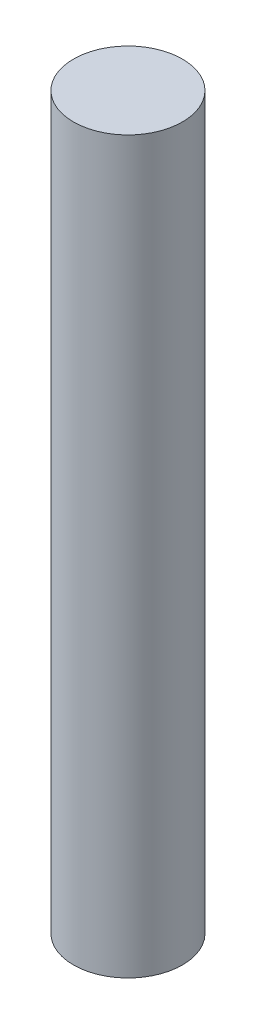
ISO-10303-21;
HEADER;
FILE_DESCRIPTION(('STEP AP214'),'2;1');
FILE_NAME('part.step','',(''),(''),'','','');
FILE_SCHEMA(('AUTOMOTIVE_DESIGN { 1 0 10303 214 1 1 1 1 }'));
ENDSEC;
DATA;
#1=APPLICATION_CONTEXT('core data for automotive mechanical design processes');
#2=APPLICATION_PROTOCOL_DEFINITION('international standard','automotive_design',2000,#1);
#3=PRODUCT_CONTEXT('',#1,'mechanical');
#4=PRODUCT('Part','Part','',(#3));
#5=PRODUCT_RELATED_PRODUCT_CATEGORY('part','',(#4));
#6=PRODUCT_DEFINITION_FORMATION('','',#4);
#7=PRODUCT_DEFINITION_CONTEXT('part definition',#1,'design');
#8=PRODUCT_DEFINITION('design','',#6,#7);
#9=PRODUCT_DEFINITION_SHAPE('','',#8);
#10=(LENGTH_UNIT() NAMED_UNIT(*) SI_UNIT(.MILLI.,.METRE.));
#11=(NAMED_UNIT(*) PLANE_ANGLE_UNIT() SI_UNIT($,.RADIAN.));
#12=(NAMED_UNIT(*) SI_UNIT($,.STERADIAN.) SOLID_ANGLE_UNIT());
#13=UNCERTAINTY_MEASURE_WITH_UNIT(LENGTH_MEASURE(1.E-05),#10,'distance_accuracy_value','');
#14=(GEOMETRIC_REPRESENTATION_CONTEXT(3) GLOBAL_UNCERTAINTY_ASSIGNED_CONTEXT((#13)) GLOBAL_UNIT_ASSIGNED_CONTEXT((#10,
#11,#12)) REPRESENTATION_CONTEXT('',''));
#15=CARTESIAN_POINT('',(0.,0.,0.));
#16=DIRECTION('',(0.,0.,1.));
#17=DIRECTION('',(1.,0.,0.));
#18=AXIS2_PLACEMENT_3D('',#15,#16,#17);
#19=CARTESIAN_POINT('',(0.,42.545,0.));
#20=DIRECTION('',(0.,-1.,0.));
#21=DIRECTION('',(0.,0.,-1.));
#22=AXIS2_PLACEMENT_3D('',#19,#20,#21);
#23=CYLINDRICAL_SURFACE('',#22,3.175);
#24=CARTESIAN_POINT('',(0.,42.545,0.));
#25=DIRECTION('',(0.,1.,0.));
#26=DIRECTION('',(0.,0.,1.));
#27=AXIS2_PLACEMENT_3D('',#24,#25,#26);
#28=CIRCLE('',#27,3.175);
#29=CARTESIAN_POINT('',(0.,42.545,3.175));
#30=VERTEX_POINT('',#29);
#31=EDGE_CURVE('E10',#30,#30,#28,.T.);
#32=ORIENTED_EDGE('',*,*,#31,.F.);
#33=EDGE_LOOP('',(#32));
#34=FACE_BOUND('',#33,.T.);
#35=CARTESIAN_POINT('',(0.,0.,0.));
#36=DIRECTION('',(0.,1.,0.));
#37=DIRECTION('',(0.,0.,1.));
#38=AXIS2_PLACEMENT_3D('',#35,#36,#37);
#39=CIRCLE('',#38,3.175);
#40=CARTESIAN_POINT('',(0.,0.,3.175));
#41=VERTEX_POINT('',#40);
#42=EDGE_CURVE('E33',#41,#41,#39,.T.);
#43=ORIENTED_EDGE('',*,*,#42,.T.);
#44=EDGE_LOOP('',(#43));
#45=FACE_BOUND('',#44,.T.);
#46=ADVANCED_FACE('F30',(#34,#45),#23,.T.);
#47=CARTESIAN_POINT('',(0.,42.545,0.));
#48=DIRECTION('',(0.,1.,0.));
#49=DIRECTION('',(0.,0.,1.));
#50=AXIS2_PLACEMENT_3D('',#47,#48,#49);
#51=PLANE('',#50);
#52=ORIENTED_EDGE('',*,*,#31,.T.);
#53=EDGE_LOOP('',(#52));
#54=FACE_BOUND('',#53,.T.);
#55=ADVANCED_FACE('F45',(#54),#51,.T.);
#56=CARTESIAN_POINT('',(0.,0.,0.));
#57=DIRECTION('',(0.,1.,0.));
#58=DIRECTION('',(0.,0.,1.));
#59=AXIS2_PLACEMENT_3D('',#56,#57,#58);
#60=PLANE('',#59);
#61=ORIENTED_EDGE('',*,*,#42,.F.);
#62=EDGE_LOOP('',(#61));
#63=FACE_BOUND('',#62,.T.);
#64=ADVANCED_FACE('F43',(#63),#60,.F.);
#65=CLOSED_SHELL('',(#46,#55,#64));
#66=MANIFOLD_SOLID_BREP('B2',#65);
#67=ADVANCED_BREP_SHAPE_REPRESENTATION('',(#18,#66),#14);
#68=SHAPE_DEFINITION_REPRESENTATION(#9,#67);
ENDSEC;
END-ISO-10303-21;
